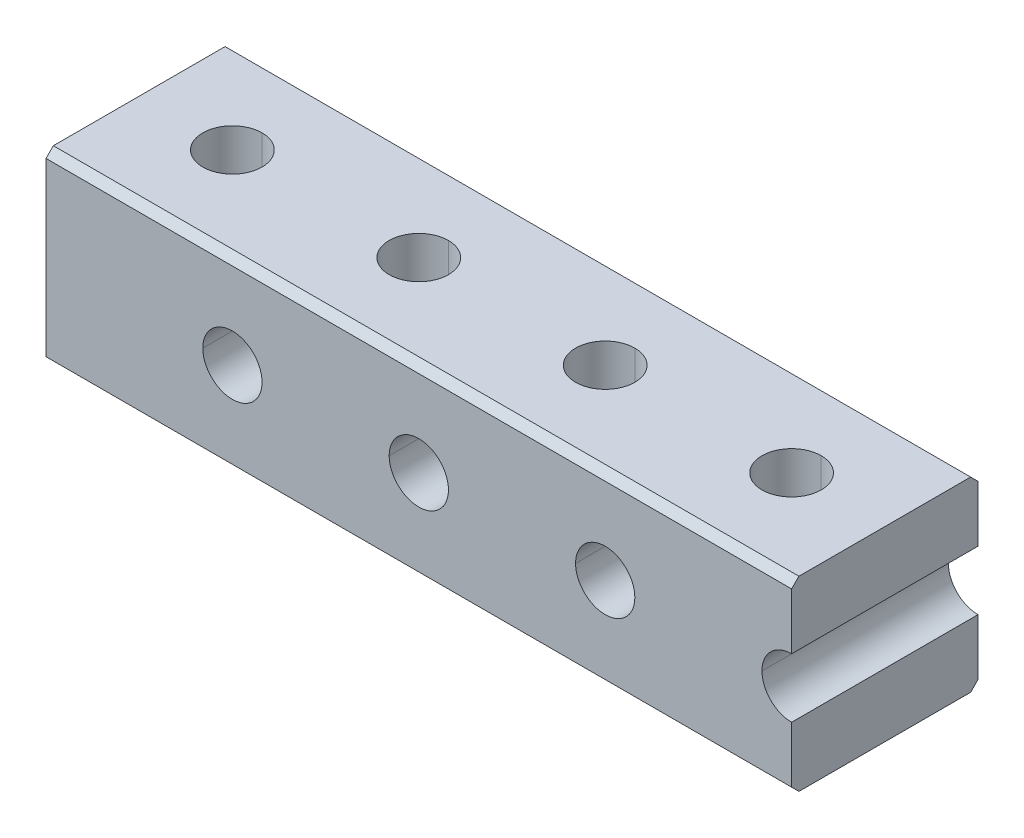
ISO-10303-21;
HEADER;
FILE_DESCRIPTION(('STEP AP214'),'2;1');
FILE_NAME('part.step','',(''),(''),'','','');
FILE_SCHEMA(('AUTOMOTIVE_DESIGN { 1 0 10303 214 1 1 1 1 }'));
ENDSEC;
DATA;
#1=APPLICATION_CONTEXT('core data for automotive mechanical design processes');
#2=APPLICATION_PROTOCOL_DEFINITION('international standard','automotive_design',2000,#1);
#3=PRODUCT_CONTEXT('',#1,'mechanical');
#4=PRODUCT('Part','Part','',(#3));
#5=PRODUCT_RELATED_PRODUCT_CATEGORY('part','',(#4));
#6=PRODUCT_DEFINITION_FORMATION('','',#4);
#7=PRODUCT_DEFINITION_CONTEXT('part definition',#1,'design');
#8=PRODUCT_DEFINITION('design','',#6,#7);
#9=PRODUCT_DEFINITION_SHAPE('','',#8);
#10=(LENGTH_UNIT() NAMED_UNIT(*) SI_UNIT(.MILLI.,.METRE.));
#11=(NAMED_UNIT(*) PLANE_ANGLE_UNIT() SI_UNIT($,.RADIAN.));
#12=(NAMED_UNIT(*) SI_UNIT($,.STERADIAN.) SOLID_ANGLE_UNIT());
#13=UNCERTAINTY_MEASURE_WITH_UNIT(LENGTH_MEASURE(1.E-05),#10,'distance_accuracy_value','');
#14=(GEOMETRIC_REPRESENTATION_CONTEXT(3) GLOBAL_UNCERTAINTY_ASSIGNED_CONTEXT((#13)) GLOBAL_UNIT_ASSIGNED_CONTEXT((#10,
#11,#12)) REPRESENTATION_CONTEXT('',''));
#15=CARTESIAN_POINT('',(0.,0.,0.));
#16=DIRECTION('',(0.,0.,1.));
#17=DIRECTION('',(1.,0.,0.));
#18=AXIS2_PLACEMENT_3D('',#15,#16,#17);
#19=CARTESIAN_POINT('',(76.2,5.85,6.35));
#20=DIRECTION('',(0.,-0.707106781186548,-0.707106781186548));
#21=DIRECTION('',(0.,-0.707106781186548,0.707106781186548));
#22=AXIS2_PLACEMENT_3D('',#19,#20,#21);
#23=PLANE('',#22);
#24=DIRECTION('',(-1.,0.,0.));
#25=VECTOR('',#24,1.);
#26=CARTESIAN_POINT('',(76.2,5.85,6.35));
#27=LINE('',#26,#25);
#28=CARTESIAN_POINT('',(-25.4,5.85,6.35));
#29=VERTEX_POINT('',#28);
#30=CARTESIAN_POINT('',(-76.2,5.85,6.35));
#31=VERTEX_POINT('',#30);
#32=EDGE_CURVE('E340',#29,#31,#27,.T.);
#33=ORIENTED_EDGE('',*,*,#32,.F.);
#34=DIRECTION('',(0.,0.707106781186548,-0.707106781186548));
#35=VECTOR('',#34,1.);
#36=CARTESIAN_POINT('',(-25.4,5.85,6.35));
#37=LINE('',#36,#35);
#38=CARTESIAN_POINT('',(-25.4,6.35,5.85));
#39=VERTEX_POINT('',#38);
#40=EDGE_CURVE('E265',#29,#39,#37,.T.);
#41=ORIENTED_EDGE('',*,*,#40,.T.);
#42=DIRECTION('',(1.,0.,0.));
#43=VECTOR('',#42,1.);
#44=CARTESIAN_POINT('',(76.2,6.35,5.85));
#45=LINE('',#44,#43);
#46=CARTESIAN_POINT('',(-76.2,6.35,5.85));
#47=VERTEX_POINT('',#46);
#48=EDGE_CURVE('E275',#47,#39,#45,.T.);
#49=ORIENTED_EDGE('',*,*,#48,.F.);
#50=DIRECTION('',(0.,0.707106781186548,-0.707106781186548));
#51=VECTOR('',#50,1.);
#52=CARTESIAN_POINT('',(-76.2,5.85,6.35));
#53=LINE('',#52,#51);
#54=EDGE_CURVE('E450',#31,#47,#53,.T.);
#55=ORIENTED_EDGE('',*,*,#54,.F.);
#56=EDGE_LOOP('',(#33,#41,#49,#55));
#57=FACE_BOUND('',#56,.T.);
#58=ADVANCED_FACE('F53',(#57),#23,.F.);
#59=CARTESIAN_POINT('',(76.2,6.35,-5.85));
#60=DIRECTION('',(0.,-0.707106781186548,0.707106781186548));
#61=DIRECTION('',(-1.,0.,0.));
#62=AXIS2_PLACEMENT_3D('',#59,#60,#61);
#63=PLANE('',#62);
#64=DIRECTION('',(-1.,0.,0.));
#65=VECTOR('',#64,1.);
#66=CARTESIAN_POINT('',(76.2,6.35,-5.85));
#67=LINE('',#66,#65);
#68=CARTESIAN_POINT('',(-25.4,6.35,-5.85));
#69=VERTEX_POINT('',#68);
#70=CARTESIAN_POINT('',(-76.2,6.35,-5.85));
#71=VERTEX_POINT('',#70);
#72=EDGE_CURVE('E272',#69,#71,#67,.T.);
#73=ORIENTED_EDGE('',*,*,#72,.F.);
#74=DIRECTION('',(0.,-0.707106781186548,-0.707106781186548));
#75=VECTOR('',#74,1.);
#76=CARTESIAN_POINT('',(-25.4,6.35,-5.85));
#77=LINE('',#76,#75);
#78=CARTESIAN_POINT('',(-25.4,5.85,-6.35));
#79=VERTEX_POINT('',#78);
#80=EDGE_CURVE('E255',#69,#79,#77,.T.);
#81=ORIENTED_EDGE('',*,*,#80,.T.);
#82=DIRECTION('',(1.,0.,0.));
#83=VECTOR('',#82,1.);
#84=CARTESIAN_POINT('',(76.2,5.85,-6.35));
#85=LINE('',#84,#83);
#86=CARTESIAN_POINT('',(-76.2,5.85,-6.35));
#87=VERTEX_POINT('',#86);
#88=EDGE_CURVE('E379',#87,#79,#85,.T.);
#89=ORIENTED_EDGE('',*,*,#88,.F.);
#90=DIRECTION('',(0.,-0.707106781186548,-0.707106781186548));
#91=VECTOR('',#90,1.);
#92=CARTESIAN_POINT('',(-76.2,6.35,-5.85));
#93=LINE('',#92,#91);
#94=EDGE_CURVE('E61',#71,#87,#93,.T.);
#95=ORIENTED_EDGE('',*,*,#94,.F.);
#96=EDGE_LOOP('',(#73,#81,#89,#95));
#97=FACE_BOUND('',#96,.T.);
#98=ADVANCED_FACE('F278',(#97),#63,.F.);
#99=CARTESIAN_POINT('',(76.2,-6.35,5.85));
#100=DIRECTION('',(0.,0.707106781186548,-0.707106781186548));
#101=DIRECTION('',(-1.,0.,0.));
#102=AXIS2_PLACEMENT_3D('',#99,#100,#101);
#103=PLANE('',#102);
#104=DIRECTION('',(-1.,0.,0.));
#105=VECTOR('',#104,1.);
#106=CARTESIAN_POINT('',(76.2,-6.35,5.85));
#107=LINE('',#106,#105);
#108=CARTESIAN_POINT('',(-25.4,-6.35,5.85));
#109=VERTEX_POINT('',#108);
#110=CARTESIAN_POINT('',(-76.2,-6.35,5.85));
#111=VERTEX_POINT('',#110);
#112=EDGE_CURVE('E434',#109,#111,#107,.T.);
#113=ORIENTED_EDGE('',*,*,#112,.F.);
#114=DIRECTION('',(0.,0.707106781186548,0.707106781186548));
#115=VECTOR('',#114,1.);
#116=CARTESIAN_POINT('',(-25.4,-6.35,5.85));
#117=LINE('',#116,#115);
#118=CARTESIAN_POINT('',(-25.4,-5.85,6.35));
#119=VERTEX_POINT('',#118);
#120=EDGE_CURVE('E266',#109,#119,#117,.T.);
#121=ORIENTED_EDGE('',*,*,#120,.T.);
#122=DIRECTION('',(1.,0.,0.));
#123=VECTOR('',#122,1.);
#124=CARTESIAN_POINT('',(76.2,-5.85,6.35));
#125=LINE('',#124,#123);
#126=CARTESIAN_POINT('',(-76.2,-5.85,6.35));
#127=VERTEX_POINT('',#126);
#128=EDGE_CURVE('E344',#127,#119,#125,.T.);
#129=ORIENTED_EDGE('',*,*,#128,.F.);
#130=DIRECTION('',(0.,0.707106781186548,0.707106781186548));
#131=VECTOR('',#130,1.);
#132=CARTESIAN_POINT('',(-76.2,-6.35,5.85));
#133=LINE('',#132,#131);
#134=EDGE_CURVE('E300',#111,#127,#133,.T.);
#135=ORIENTED_EDGE('',*,*,#134,.F.);
#136=EDGE_LOOP('',(#113,#121,#129,#135));
#137=FACE_BOUND('',#136,.T.);
#138=ADVANCED_FACE('F55',(#137),#103,.F.);
#139=CARTESIAN_POINT('',(76.2,-5.85,-6.35));
#140=DIRECTION('',(0.,0.707106781186548,0.707106781186548));
#141=DIRECTION('',(1.,0.,0.));
#142=AXIS2_PLACEMENT_3D('',#139,#140,#141);
#143=PLANE('',#142);
#144=DIRECTION('',(-1.,0.,0.));
#145=VECTOR('',#144,1.);
#146=CARTESIAN_POINT('',(76.2,-5.85,-6.35));
#147=LINE('',#146,#145);
#148=CARTESIAN_POINT('',(-25.4,-5.85,-6.35));
#149=VERTEX_POINT('',#148);
#150=CARTESIAN_POINT('',(-76.2,-5.85,-6.35));
#151=VERTEX_POINT('',#150);
#152=EDGE_CURVE('E398',#149,#151,#147,.T.);
#153=ORIENTED_EDGE('',*,*,#152,.F.);
#154=DIRECTION('',(0.,-0.707106781186548,0.707106781186548));
#155=VECTOR('',#154,1.);
#156=CARTESIAN_POINT('',(-25.4,-5.85,-6.35));
#157=LINE('',#156,#155);
#158=CARTESIAN_POINT('',(-25.4,-6.35,-5.85));
#159=VERTEX_POINT('',#158);
#160=EDGE_CURVE('E1385',#149,#159,#157,.T.);
#161=ORIENTED_EDGE('',*,*,#160,.T.);
#162=DIRECTION('',(1.,0.,0.));
#163=VECTOR('',#162,1.);
#164=CARTESIAN_POINT('',(76.2,-6.35,-5.85));
#165=LINE('',#164,#163);
#166=CARTESIAN_POINT('',(-76.2,-6.35,-5.85));
#167=VERTEX_POINT('',#166);
#168=EDGE_CURVE('E430',#167,#159,#165,.T.);
#169=ORIENTED_EDGE('',*,*,#168,.F.);
#170=DIRECTION('',(0.,-0.707106781186548,0.707106781186548));
#171=VECTOR('',#170,1.);
#172=CARTESIAN_POINT('',(-76.2,-5.85,-6.35));
#173=LINE('',#172,#171);
#174=EDGE_CURVE('E297',#151,#167,#173,.T.);
#175=ORIENTED_EDGE('',*,*,#174,.F.);
#176=EDGE_LOOP('',(#153,#161,#169,#175));
#177=FACE_BOUND('',#176,.T.);
#178=ADVANCED_FACE('F467',(#177),#143,.F.);
#179=CARTESIAN_POINT('',(-69.85,6.35,0.));
#180=DIRECTION('',(0.,1.,0.));
#181=DIRECTION('',(0.,0.,1.));
#182=AXIS2_PLACEMENT_3D('',#179,#180,#181);
#183=CYLINDRICAL_SURFACE('',#182,2.0193);
#184=DIRECTION('',(0.,1.,0.));
#185=VECTOR('',#184,1.);
#186=CARTESIAN_POINT('',(-69.85,6.35,-2.0193));
#187=LINE('',#186,#185);
#188=CARTESIAN_POINT('',(-69.85,-6.35,-2.0193));
#189=VERTEX_POINT('',#188);
#190=CARTESIAN_POINT('',(-69.85,6.35,-2.0193));
#191=VERTEX_POINT('',#190);
#192=EDGE_CURVE('E491',#189,#191,#187,.T.);
#193=ORIENTED_EDGE('',*,*,#192,.F.);
#194=CARTESIAN_POINT('',(-69.85,-6.35,0.));
#195=DIRECTION('',(0.,1.,0.));
#196=DIRECTION('',(0.,0.,1.));
#197=AXIS2_PLACEMENT_3D('',#194,#195,#196);
#198=CIRCLE('',#197,2.0193);
#199=CARTESIAN_POINT('',(-69.85,-6.35,2.0193));
#200=VERTEX_POINT('',#199);
#201=EDGE_CURVE('E437',#200,#189,#198,.T.);
#202=ORIENTED_EDGE('',*,*,#201,.F.);
#203=DIRECTION('',(0.,1.,0.));
#204=VECTOR('',#203,1.);
#205=CARTESIAN_POINT('',(-69.85,6.35,2.0193));
#206=LINE('',#205,#204);
#207=CARTESIAN_POINT('',(-69.85,6.35,2.0193));
#208=VERTEX_POINT('',#207);
#209=EDGE_CURVE('E519',#200,#208,#206,.T.);
#210=ORIENTED_EDGE('',*,*,#209,.T.);
#211=CARTESIAN_POINT('',(-69.85,6.35,0.));
#212=DIRECTION('',(0.,1.,0.));
#213=DIRECTION('',(0.,0.,1.));
#214=AXIS2_PLACEMENT_3D('',#211,#212,#213);
#215=CIRCLE('',#214,2.0193);
#216=EDGE_CURVE('E401',#208,#191,#215,.T.);
#217=ORIENTED_EDGE('',*,*,#216,.T.);
#218=EDGE_LOOP('',(#193,#202,#210,#217));
#219=FACE_BOUND('',#218,.T.);
#220=ADVANCED_FACE('F558',(#219),#183,.F.);
#221=CARTESIAN_POINT('',(-57.15,6.35,0.));
#222=DIRECTION('',(0.,1.,0.));
#223=DIRECTION('',(0.,0.,1.));
#224=AXIS2_PLACEMENT_3D('',#221,#222,#223);
#225=CYLINDRICAL_SURFACE('',#224,2.0193);
#226=DIRECTION('',(0.,1.,0.));
#227=VECTOR('',#226,1.);
#228=CARTESIAN_POINT('',(-57.15,6.35,-2.0193));
#229=LINE('',#228,#227);
#230=CARTESIAN_POINT('',(-57.15,-6.35,-2.0193));
#231=VERTEX_POINT('',#230);
#232=CARTESIAN_POINT('',(-57.15,6.35,-2.0193));
#233=VERTEX_POINT('',#232);
#234=EDGE_CURVE('E502',#231,#233,#229,.T.);
#235=ORIENTED_EDGE('',*,*,#234,.F.);
#236=CARTESIAN_POINT('',(-57.15,-6.35,0.));
#237=DIRECTION('',(0.,1.,0.));
#238=DIRECTION('',(0.,0.,1.));
#239=AXIS2_PLACEMENT_3D('',#236,#237,#238);
#240=CIRCLE('',#239,2.0193);
#241=CARTESIAN_POINT('',(-57.15,-6.35,2.0193));
#242=VERTEX_POINT('',#241);
#243=EDGE_CURVE('E440',#242,#231,#240,.T.);
#244=ORIENTED_EDGE('',*,*,#243,.F.);
#245=DIRECTION('',(0.,1.,0.));
#246=VECTOR('',#245,1.);
#247=CARTESIAN_POINT('',(-57.15,6.35,2.0193));
#248=LINE('',#247,#246);
#249=CARTESIAN_POINT('',(-57.15,6.35,2.0193));
#250=VERTEX_POINT('',#249);
#251=EDGE_CURVE('E307',#242,#250,#248,.T.);
#252=ORIENTED_EDGE('',*,*,#251,.T.);
#253=CARTESIAN_POINT('',(-57.15,6.35,0.));
#254=DIRECTION('',(0.,1.,0.));
#255=DIRECTION('',(0.,0.,1.));
#256=AXIS2_PLACEMENT_3D('',#253,#254,#255);
#257=CIRCLE('',#256,2.0193);
#258=EDGE_CURVE('E406',#250,#233,#257,.T.);
#259=ORIENTED_EDGE('',*,*,#258,.T.);
#260=EDGE_LOOP('',(#235,#244,#252,#259));
#261=FACE_BOUND('',#260,.T.);
#262=ADVANCED_FACE('F599',(#261),#225,.F.);
#263=CARTESIAN_POINT('',(-44.45,6.35,0.));
#264=DIRECTION('',(0.,1.,0.));
#265=DIRECTION('',(0.,0.,1.));
#266=AXIS2_PLACEMENT_3D('',#263,#264,#265);
#267=CYLINDRICAL_SURFACE('',#266,2.0193);
#268=DIRECTION('',(0.,1.,0.));
#269=VECTOR('',#268,1.);
#270=CARTESIAN_POINT('',(-44.45,6.35,-2.0193));
#271=LINE('',#270,#269);
#272=CARTESIAN_POINT('',(-44.45,-6.35,-2.0193));
#273=VERTEX_POINT('',#272);
#274=CARTESIAN_POINT('',(-44.45,6.35,-2.0193));
#275=VERTEX_POINT('',#274);
#276=EDGE_CURVE('E306',#273,#275,#271,.T.);
#277=ORIENTED_EDGE('',*,*,#276,.F.);
#278=CARTESIAN_POINT('',(-44.45,-6.35,0.));
#279=DIRECTION('',(0.,1.,0.));
#280=DIRECTION('',(0.,0.,1.));
#281=AXIS2_PLACEMENT_3D('',#278,#279,#280);
#282=CIRCLE('',#281,2.0193);
#283=CARTESIAN_POINT('',(-44.45,-6.35,2.0193));
#284=VERTEX_POINT('',#283);
#285=EDGE_CURVE('E443',#284,#273,#282,.T.);
#286=ORIENTED_EDGE('',*,*,#285,.F.);
#287=DIRECTION('',(0.,1.,0.));
#288=VECTOR('',#287,1.);
#289=CARTESIAN_POINT('',(-44.45,6.35,2.0193));
#290=LINE('',#289,#288);
#291=CARTESIAN_POINT('',(-44.45,6.35,2.0193));
#292=VERTEX_POINT('',#291);
#293=EDGE_CURVE('E308',#284,#292,#290,.T.);
#294=ORIENTED_EDGE('',*,*,#293,.T.);
#295=CARTESIAN_POINT('',(-44.45,6.35,0.));
#296=DIRECTION('',(0.,1.,0.));
#297=DIRECTION('',(0.,0.,1.));
#298=AXIS2_PLACEMENT_3D('',#295,#296,#297);
#299=CIRCLE('',#298,2.0193);
#300=EDGE_CURVE('E339',#292,#275,#299,.T.);
#301=ORIENTED_EDGE('',*,*,#300,.T.);
#302=EDGE_LOOP('',(#277,#286,#294,#301));
#303=FACE_BOUND('',#302,.T.);
#304=ADVANCED_FACE('F546',(#303),#267,.F.);
#305=CARTESIAN_POINT('',(-31.75,6.35,0.));
#306=DIRECTION('',(0.,1.,0.));
#307=DIRECTION('',(0.,0.,1.));
#308=AXIS2_PLACEMENT_3D('',#305,#306,#307);
#309=CYLINDRICAL_SURFACE('',#308,2.0193);
#310=DIRECTION('',(0.,1.,0.));
#311=VECTOR('',#310,1.);
#312=CARTESIAN_POINT('',(-31.75,6.35,-2.0193));
#313=LINE('',#312,#311);
#314=CARTESIAN_POINT('',(-31.75,-6.35,-2.0193));
#315=VERTEX_POINT('',#314);
#316=CARTESIAN_POINT('',(-31.75,6.35,-2.0193));
#317=VERTEX_POINT('',#316);
#318=EDGE_CURVE('E317',#315,#317,#313,.T.);
#319=ORIENTED_EDGE('',*,*,#318,.F.);
#320=CARTESIAN_POINT('',(-31.75,-6.35,0.));
#321=DIRECTION('',(0.,1.,0.));
#322=DIRECTION('',(0.,0.,1.));
#323=AXIS2_PLACEMENT_3D('',#320,#321,#322);
#324=CIRCLE('',#323,2.0193);
#325=CARTESIAN_POINT('',(-31.75,-6.35,2.0193));
#326=VERTEX_POINT('',#325);
#327=EDGE_CURVE('E301',#326,#315,#324,.T.);
#328=ORIENTED_EDGE('',*,*,#327,.F.);
#329=DIRECTION('',(0.,1.,0.));
#330=VECTOR('',#329,1.);
#331=CARTESIAN_POINT('',(-31.75,6.35,2.0193));
#332=LINE('',#331,#330);
#333=CARTESIAN_POINT('',(-31.75,6.35,2.0193));
#334=VERTEX_POINT('',#333);
#335=EDGE_CURVE('E295',#326,#334,#332,.T.);
#336=ORIENTED_EDGE('',*,*,#335,.T.);
#337=CARTESIAN_POINT('',(-31.75,6.35,0.));
#338=DIRECTION('',(0.,1.,0.));
#339=DIRECTION('',(0.,0.,1.));
#340=AXIS2_PLACEMENT_3D('',#337,#338,#339);
#341=CIRCLE('',#340,2.0193);
#342=EDGE_CURVE('E335',#334,#317,#341,.T.);
#343=ORIENTED_EDGE('',*,*,#342,.T.);
#344=EDGE_LOOP('',(#319,#328,#336,#343));
#345=FACE_BOUND('',#344,.T.);
#346=ADVANCED_FACE('F593',(#345),#309,.F.);
#347=CARTESIAN_POINT('',(-63.5,0.,6.35));
#348=DIRECTION('',(0.,0.,1.));
#349=DIRECTION('',(1.,0.,0.));
#350=AXIS2_PLACEMENT_3D('',#347,#348,#349);
#351=CYLINDRICAL_SURFACE('',#350,2.0193);
#352=DIRECTION('',(0.,0.,1.));
#353=VECTOR('',#352,1.);
#354=CARTESIAN_POINT('',(-65.5193,0.,6.35));
#355=LINE('',#354,#353);
#356=CARTESIAN_POINT('',(-65.5193,0.,-6.35));
#357=VERTEX_POINT('',#356);
#358=CARTESIAN_POINT('',(-65.5193,0.,6.35));
#359=VERTEX_POINT('',#358);
#360=EDGE_CURVE('E330',#357,#359,#355,.T.);
#361=ORIENTED_EDGE('',*,*,#360,.F.);
#362=CARTESIAN_POINT('',(-63.5,0.,-6.35));
#363=DIRECTION('',(0.,0.,1.));
#364=DIRECTION('',(1.,0.,0.));
#365=AXIS2_PLACEMENT_3D('',#362,#363,#364);
#366=CIRCLE('',#365,2.0193);
#367=CARTESIAN_POINT('',(-61.4807,0.,-6.35));
#368=VERTEX_POINT('',#367);
#369=EDGE_CURVE('E334',#368,#357,#366,.T.);
#370=ORIENTED_EDGE('',*,*,#369,.F.);
#371=DIRECTION('',(0.,0.,1.));
#372=VECTOR('',#371,1.);
#373=CARTESIAN_POINT('',(-61.4807,0.,6.35));
#374=LINE('',#373,#372);
#375=CARTESIAN_POINT('',(-61.4807,0.,6.35));
#376=VERTEX_POINT('',#375);
#377=EDGE_CURVE('E361',#368,#376,#374,.T.);
#378=ORIENTED_EDGE('',*,*,#377,.T.);
#379=CARTESIAN_POINT('',(-63.5,0.,6.35));
#380=DIRECTION('',(0.,0.,1.));
#381=DIRECTION('',(1.,0.,0.));
#382=AXIS2_PLACEMENT_3D('',#379,#380,#381);
#383=CIRCLE('',#382,2.0193);
#384=EDGE_CURVE('E343',#376,#359,#383,.T.);
#385=ORIENTED_EDGE('',*,*,#384,.T.);
#386=EDGE_LOOP('',(#361,#370,#378,#385));
#387=FACE_BOUND('',#386,.T.);
#388=ADVANCED_FACE('F590',(#387),#351,.F.);
#389=CARTESIAN_POINT('',(-50.8,0.,6.35));
#390=DIRECTION('',(0.,0.,1.));
#391=DIRECTION('',(1.,0.,0.));
#392=AXIS2_PLACEMENT_3D('',#389,#390,#391);
#393=CYLINDRICAL_SURFACE('',#392,2.0193);
#394=DIRECTION('',(0.,0.,1.));
#395=VECTOR('',#394,1.);
#396=CARTESIAN_POINT('',(-52.8193,0.,6.35));
#397=LINE('',#396,#395);
#398=CARTESIAN_POINT('',(-52.8193,0.,-6.35));
#399=VERTEX_POINT('',#398);
#400=CARTESIAN_POINT('',(-52.8193,0.,6.35));
#401=VERTEX_POINT('',#400);
#402=EDGE_CURVE('E369',#399,#401,#397,.T.);
#403=ORIENTED_EDGE('',*,*,#402,.F.);
#404=CARTESIAN_POINT('',(-50.8,0.,-6.35));
#405=DIRECTION('',(0.,0.,1.));
#406=DIRECTION('',(1.,0.,0.));
#407=AXIS2_PLACEMENT_3D('',#404,#405,#406);
#408=CIRCLE('',#407,2.0193);
#409=CARTESIAN_POINT('',(-48.7807,0.,-6.35));
#410=VERTEX_POINT('',#409);
#411=EDGE_CURVE('E331',#410,#399,#408,.T.);
#412=ORIENTED_EDGE('',*,*,#411,.F.);
#413=DIRECTION('',(0.,0.,1.));
#414=VECTOR('',#413,1.);
#415=CARTESIAN_POINT('',(-48.7807,0.,6.35));
#416=LINE('',#415,#414);
#417=CARTESIAN_POINT('',(-48.7807,0.,6.35));
#418=VERTEX_POINT('',#417);
#419=EDGE_CURVE('E374',#410,#418,#416,.T.);
#420=ORIENTED_EDGE('',*,*,#419,.T.);
#421=CARTESIAN_POINT('',(-50.8,0.,6.35));
#422=DIRECTION('',(0.,0.,1.));
#423=DIRECTION('',(1.,0.,0.));
#424=AXIS2_PLACEMENT_3D('',#421,#422,#423);
#425=CIRCLE('',#424,2.0193);
#426=EDGE_CURVE('E422',#418,#401,#425,.T.);
#427=ORIENTED_EDGE('',*,*,#426,.T.);
#428=EDGE_LOOP('',(#403,#412,#420,#427));
#429=FACE_BOUND('',#428,.T.);
#430=ADVANCED_FACE('F588',(#429),#393,.F.);
#431=CARTESIAN_POINT('',(-38.1,0.,6.35));
#432=DIRECTION('',(0.,0.,1.));
#433=DIRECTION('',(1.,0.,0.));
#434=AXIS2_PLACEMENT_3D('',#431,#432,#433);
#435=CYLINDRICAL_SURFACE('',#434,2.0193);
#436=DIRECTION('',(0.,0.,1.));
#437=VECTOR('',#436,1.);
#438=CARTESIAN_POINT('',(-40.1193,0.,6.35));
#439=LINE('',#438,#437);
#440=CARTESIAN_POINT('',(-40.1193,0.,-6.35));
#441=VERTEX_POINT('',#440);
#442=CARTESIAN_POINT('',(-40.1193,0.,6.35));
#443=VERTEX_POINT('',#442);
#444=EDGE_CURVE('E350',#441,#443,#439,.T.);
#445=ORIENTED_EDGE('',*,*,#444,.F.);
#446=CARTESIAN_POINT('',(-38.1,0.,-6.35));
#447=DIRECTION('',(0.,0.,1.));
#448=DIRECTION('',(1.,0.,0.));
#449=AXIS2_PLACEMENT_3D('',#446,#447,#448);
#450=CIRCLE('',#449,2.0193);
#451=CARTESIAN_POINT('',(-36.0807,0.,-6.35));
#452=VERTEX_POINT('',#451);
#453=EDGE_CURVE('E291',#452,#441,#450,.T.);
#454=ORIENTED_EDGE('',*,*,#453,.F.);
#455=DIRECTION('',(0.,0.,1.));
#456=VECTOR('',#455,1.);
#457=CARTESIAN_POINT('',(-36.0807,0.,6.35));
#458=LINE('',#457,#456);
#459=CARTESIAN_POINT('',(-36.0807,0.,6.35));
#460=VERTEX_POINT('',#459);
#461=EDGE_CURVE('E349',#452,#460,#458,.T.);
#462=ORIENTED_EDGE('',*,*,#461,.T.);
#463=CARTESIAN_POINT('',(-38.1,0.,6.35));
#464=DIRECTION('',(0.,0.,1.));
#465=DIRECTION('',(1.,0.,0.));
#466=AXIS2_PLACEMENT_3D('',#463,#464,#465);
#467=CIRCLE('',#466,2.0193);
#468=EDGE_CURVE('E325',#460,#443,#467,.T.);
#469=ORIENTED_EDGE('',*,*,#468,.T.);
#470=EDGE_LOOP('',(#445,#454,#462,#469));
#471=FACE_BOUND('',#470,.T.);
#472=ADVANCED_FACE('F585',(#471),#435,.F.);
#473=CARTESIAN_POINT('',(-25.4,0.,6.35));
#474=DIRECTION('',(0.,0.,1.));
#475=DIRECTION('',(1.,0.,0.));
#476=AXIS2_PLACEMENT_3D('',#473,#474,#475);
#477=CYLINDRICAL_SURFACE('',#476,2.0193);
#478=CARTESIAN_POINT('',(-25.4,0.,-6.35));
#479=DIRECTION('',(0.,0.,1.));
#480=DIRECTION('',(1.,0.,0.));
#481=AXIS2_PLACEMENT_3D('',#478,#479,#480);
#482=CIRCLE('',#481,2.0193);
#483=CARTESIAN_POINT('',(-25.4,2.0193,-6.35));
#484=VERTEX_POINT('',#483);
#485=CARTESIAN_POINT('',(-27.4193,0.,-6.35));
#486=VERTEX_POINT('',#485);
#487=EDGE_CURVE('E282',#484,#486,#482,.T.);
#488=ORIENTED_EDGE('',*,*,#487,.F.);
#489=DIRECTION('',(0.,0.,1.));
#490=VECTOR('',#489,1.);
#491=CARTESIAN_POINT('',(-25.4,2.0193,6.35));
#492=LINE('',#491,#490);
#493=CARTESIAN_POINT('',(-25.4,2.0193,6.35));
#494=VERTEX_POINT('',#493);
#495=EDGE_CURVE('E68',#484,#494,#492,.T.);
#496=ORIENTED_EDGE('',*,*,#495,.T.);
#497=CARTESIAN_POINT('',(-25.4,0.,6.35));
#498=DIRECTION('',(0.,0.,1.));
#499=DIRECTION('',(1.,0.,0.));
#500=AXIS2_PLACEMENT_3D('',#497,#498,#499);
#501=CIRCLE('',#500,2.0193);
#502=CARTESIAN_POINT('',(-27.4193,0.,6.35));
#503=VERTEX_POINT('',#502);
#504=EDGE_CURVE('E322',#494,#503,#501,.T.);
#505=ORIENTED_EDGE('',*,*,#504,.T.);
#506=DIRECTION('',(0.,0.,1.));
#507=VECTOR('',#506,1.);
#508=CARTESIAN_POINT('',(-27.4193,0.,6.35));
#509=LINE('',#508,#507);
#510=EDGE_CURVE('E390',#486,#503,#509,.T.);
#511=ORIENTED_EDGE('',*,*,#510,.F.);
#512=EDGE_LOOP('',(#488,#496,#505,#511));
#513=FACE_BOUND('',#512,.T.);
#514=ADVANCED_FACE('F572',(#513),#477,.F.);
#515=CARTESIAN_POINT('',(-76.2,0.,0.));
#516=DIRECTION('',(1.,0.,0.));
#517=DIRECTION('',(0.,1.,0.));
#518=AXIS2_PLACEMENT_3D('',#515,#516,#517);
#519=PLANE('',#518);
#520=DIRECTION('',(0.,1.,0.));
#521=VECTOR('',#520,1.);
#522=CARTESIAN_POINT('',(-76.2,6.35,-6.35));
#523=LINE('',#522,#521);
#524=EDGE_CURVE('E382',#151,#87,#523,.T.);
#525=ORIENTED_EDGE('',*,*,#524,.F.);
#526=ORIENTED_EDGE('',*,*,#174,.T.);
#527=DIRECTION('',(0.,0.,-1.));
#528=VECTOR('',#527,1.);
#529=CARTESIAN_POINT('',(-76.2,-6.35,6.35));
#530=LINE('',#529,#528);
#531=EDGE_CURVE('E324',#111,#167,#530,.T.);
#532=ORIENTED_EDGE('',*,*,#531,.F.);
#533=ORIENTED_EDGE('',*,*,#134,.T.);
#534=DIRECTION('',(0.,-1.,0.));
#535=VECTOR('',#534,1.);
#536=CARTESIAN_POINT('',(-76.2,6.35,6.35));
#537=LINE('',#536,#535);
#538=EDGE_CURVE('E338',#31,#127,#537,.T.);
#539=ORIENTED_EDGE('',*,*,#538,.F.);
#540=ORIENTED_EDGE('',*,*,#54,.T.);
#541=DIRECTION('',(0.,0.,1.));
#542=VECTOR('',#541,1.);
#543=CARTESIAN_POINT('',(-76.2,6.35,6.35));
#544=LINE('',#543,#542);
#545=EDGE_CURVE('E281',#71,#47,#544,.T.);
#546=ORIENTED_EDGE('',*,*,#545,.F.);
#547=ORIENTED_EDGE('',*,*,#94,.T.);
#548=EDGE_LOOP('',(#525,#526,#532,#533,#539,#540,#546,#547));
#549=FACE_BOUND('',#548,.T.);
#550=ADVANCED_FACE('F458',(#549),#519,.F.);
#551=CARTESIAN_POINT('',(76.2,-6.35,6.35));
#552=DIRECTION('',(0.,1.,0.));
#553=DIRECTION('',(1.,0.,0.));
#554=AXIS2_PLACEMENT_3D('',#551,#552,#553);
#555=PLANE('',#554);
#556=ORIENTED_EDGE('',*,*,#327,.T.);
#557=CARTESIAN_POINT('',(-31.75,-6.35,0.));
#558=DIRECTION('',(0.,1.,0.));
#559=DIRECTION('',(0.,0.,1.));
#560=AXIS2_PLACEMENT_3D('',#557,#558,#559);
#561=CIRCLE('',#560,2.0193);
#562=EDGE_CURVE('E312',#315,#326,#561,.T.);
#563=ORIENTED_EDGE('',*,*,#562,.T.);
#564=EDGE_LOOP('',(#556,#563));
#565=FACE_BOUND('',#564,.T.);
#566=ORIENTED_EDGE('',*,*,#285,.T.);
#567=CARTESIAN_POINT('',(-44.45,-6.35,0.));
#568=DIRECTION('',(0.,1.,0.));
#569=DIRECTION('',(0.,0.,1.));
#570=AXIS2_PLACEMENT_3D('',#567,#568,#569);
#571=CIRCLE('',#570,2.0193);
#572=EDGE_CURVE('E302',#273,#284,#571,.T.);
#573=ORIENTED_EDGE('',*,*,#572,.T.);
#574=EDGE_LOOP('',(#566,#573));
#575=FACE_BOUND('',#574,.T.);
#576=ORIENTED_EDGE('',*,*,#243,.T.);
#577=CARTESIAN_POINT('',(-57.15,-6.35,0.));
#578=DIRECTION('',(0.,1.,0.));
#579=DIRECTION('',(0.,0.,1.));
#580=AXIS2_PLACEMENT_3D('',#577,#578,#579);
#581=CIRCLE('',#580,2.0193);
#582=EDGE_CURVE('E523',#231,#242,#581,.T.);
#583=ORIENTED_EDGE('',*,*,#582,.T.);
#584=EDGE_LOOP('',(#576,#583));
#585=FACE_BOUND('',#584,.T.);
#586=ORIENTED_EDGE('',*,*,#201,.T.);
#587=CARTESIAN_POINT('',(-69.85,-6.35,0.));
#588=DIRECTION('',(0.,1.,0.));
#589=DIRECTION('',(0.,0.,1.));
#590=AXIS2_PLACEMENT_3D('',#587,#588,#589);
#591=CIRCLE('',#590,2.0193);
#592=EDGE_CURVE('E487',#189,#200,#591,.T.);
#593=ORIENTED_EDGE('',*,*,#592,.T.);
#594=EDGE_LOOP('',(#586,#593));
#595=FACE_BOUND('',#594,.T.);
#596=ORIENTED_EDGE('',*,*,#168,.T.);
#597=DIRECTION('',(0.,0.,-1.));
#598=VECTOR('',#597,1.);
#599=CARTESIAN_POINT('',(-25.4,-6.35,6.35));
#600=LINE('',#599,#598);
#601=EDGE_CURVE('E476',#109,#159,#600,.T.);
#602=ORIENTED_EDGE('',*,*,#601,.F.);
#603=ORIENTED_EDGE('',*,*,#112,.T.);
#604=ORIENTED_EDGE('',*,*,#531,.T.);
#605=EDGE_LOOP('',(#596,#602,#603,#604));
#606=FACE_BOUND('',#605,.T.);
#607=ADVANCED_FACE('F473',(#565,#575,#585,#595,#606),#555,.F.);
#608=CARTESIAN_POINT('',(76.2,6.35,6.35));
#609=DIRECTION('',(0.,0.,-1.));
#610=DIRECTION('',(-1.,0.,0.));
#611=AXIS2_PLACEMENT_3D('',#608,#609,#610);
#612=PLANE('',#611);
#613=ORIENTED_EDGE('',*,*,#128,.T.);
#614=DIRECTION('',(0.,-1.,0.));
#615=VECTOR('',#614,1.);
#616=CARTESIAN_POINT('',(-25.4,-6.35,6.35));
#617=LINE('',#616,#615);
#618=CARTESIAN_POINT('',(-25.4,-2.0193,6.35));
#619=VERTEX_POINT('',#618);
#620=EDGE_CURVE('E276',#619,#119,#617,.T.);
#621=ORIENTED_EDGE('',*,*,#620,.F.);
#622=CARTESIAN_POINT('',(-25.4,0.,6.35));
#623=DIRECTION('',(0.,0.,1.));
#624=DIRECTION('',(1.,0.,0.));
#625=AXIS2_PLACEMENT_3D('',#622,#623,#624);
#626=CIRCLE('',#625,2.0193);
#627=EDGE_CURVE('E394',#503,#619,#626,.T.);
#628=ORIENTED_EDGE('',*,*,#627,.F.);
#629=ORIENTED_EDGE('',*,*,#504,.F.);
#630=EDGE_CURVE('E1382',#29,#494,#617,.T.);
#631=ORIENTED_EDGE('',*,*,#630,.F.);
#632=ORIENTED_EDGE('',*,*,#32,.T.);
#633=ORIENTED_EDGE('',*,*,#538,.T.);
#634=EDGE_LOOP('',(#613,#621,#628,#629,#631,#632,#633));
#635=FACE_BOUND('',#634,.T.);
#636=ORIENTED_EDGE('',*,*,#468,.F.);
#637=CARTESIAN_POINT('',(-38.1,0.,6.35));
#638=DIRECTION('',(0.,0.,1.));
#639=DIRECTION('',(1.,0.,0.));
#640=AXIS2_PLACEMENT_3D('',#637,#638,#639);
#641=CIRCLE('',#640,2.0193);
#642=EDGE_CURVE('E345',#443,#460,#641,.T.);
#643=ORIENTED_EDGE('',*,*,#642,.F.);
#644=EDGE_LOOP('',(#636,#643));
#645=FACE_BOUND('',#644,.T.);
#646=ORIENTED_EDGE('',*,*,#426,.F.);
#647=CARTESIAN_POINT('',(-50.8,0.,6.35));
#648=DIRECTION('',(0.,0.,1.));
#649=DIRECTION('',(1.,0.,0.));
#650=AXIS2_PLACEMENT_3D('',#647,#648,#649);
#651=CIRCLE('',#650,2.0193);
#652=EDGE_CURVE('E370',#401,#418,#651,.T.);
#653=ORIENTED_EDGE('',*,*,#652,.F.);
#654=EDGE_LOOP('',(#646,#653));
#655=FACE_BOUND('',#654,.T.);
#656=ORIENTED_EDGE('',*,*,#384,.F.);
#657=CARTESIAN_POINT('',(-63.5,0.,6.35));
#658=DIRECTION('',(0.,0.,1.));
#659=DIRECTION('',(1.,0.,0.));
#660=AXIS2_PLACEMENT_3D('',#657,#658,#659);
#661=CIRCLE('',#660,2.0193);
#662=EDGE_CURVE('E354',#359,#376,#661,.T.);
#663=ORIENTED_EDGE('',*,*,#662,.F.);
#664=EDGE_LOOP('',(#656,#663));
#665=FACE_BOUND('',#664,.T.);
#666=ADVANCED_FACE('F481',(#635,#645,#655,#665),#612,.F.);
#667=CARTESIAN_POINT('',(76.2,6.35,6.35));
#668=DIRECTION('',(0.,-1.,0.));
#669=DIRECTION('',(0.,0.,-1.));
#670=AXIS2_PLACEMENT_3D('',#667,#668,#669);
#671=PLANE('',#670);
#672=ORIENTED_EDGE('',*,*,#342,.F.);
#673=CARTESIAN_POINT('',(-31.75,6.35,0.));
#674=DIRECTION('',(0.,1.,0.));
#675=DIRECTION('',(0.,0.,1.));
#676=AXIS2_PLACEMENT_3D('',#673,#674,#675);
#677=CIRCLE('',#676,2.0193);
#678=EDGE_CURVE('E321',#317,#334,#677,.T.);
#679=ORIENTED_EDGE('',*,*,#678,.F.);
#680=EDGE_LOOP('',(#672,#679));
#681=FACE_BOUND('',#680,.T.);
#682=ORIENTED_EDGE('',*,*,#300,.F.);
#683=CARTESIAN_POINT('',(-44.45,6.35,0.));
#684=DIRECTION('',(0.,1.,0.));
#685=DIRECTION('',(0.,0.,1.));
#686=AXIS2_PLACEMENT_3D('',#683,#684,#685);
#687=CIRCLE('',#686,2.0193);
#688=EDGE_CURVE('E313',#275,#292,#687,.T.);
#689=ORIENTED_EDGE('',*,*,#688,.F.);
#690=EDGE_LOOP('',(#682,#689));
#691=FACE_BOUND('',#690,.T.);
#692=ORIENTED_EDGE('',*,*,#258,.F.);
#693=CARTESIAN_POINT('',(-57.15,6.35,0.));
#694=DIRECTION('',(0.,1.,0.));
#695=DIRECTION('',(0.,0.,1.));
#696=AXIS2_PLACEMENT_3D('',#693,#694,#695);
#697=CIRCLE('',#696,2.0193);
#698=EDGE_CURVE('E498',#233,#250,#697,.T.);
#699=ORIENTED_EDGE('',*,*,#698,.F.);
#700=EDGE_LOOP('',(#692,#699));
#701=FACE_BOUND('',#700,.T.);
#702=ORIENTED_EDGE('',*,*,#216,.F.);
#703=CARTESIAN_POINT('',(-69.85,6.35,0.));
#704=DIRECTION('',(0.,1.,0.));
#705=DIRECTION('',(0.,0.,1.));
#706=AXIS2_PLACEMENT_3D('',#703,#704,#705);
#707=CIRCLE('',#706,2.0193);
#708=EDGE_CURVE('E506',#191,#208,#707,.T.);
#709=ORIENTED_EDGE('',*,*,#708,.F.);
#710=EDGE_LOOP('',(#702,#709));
#711=FACE_BOUND('',#710,.T.);
#712=ORIENTED_EDGE('',*,*,#48,.T.);
#713=DIRECTION('',(0.,0.,1.));
#714=VECTOR('',#713,1.);
#715=CARTESIAN_POINT('',(-25.4,6.35,6.35));
#716=LINE('',#715,#714);
#717=EDGE_CURVE('E258',#69,#39,#716,.T.);
#718=ORIENTED_EDGE('',*,*,#717,.F.);
#719=ORIENTED_EDGE('',*,*,#72,.T.);
#720=ORIENTED_EDGE('',*,*,#545,.T.);
#721=EDGE_LOOP('',(#712,#718,#719,#720));
#722=FACE_BOUND('',#721,.T.);
#723=ADVANCED_FACE('F270',(#681,#691,#701,#711,#722),#671,.F.);
#724=CARTESIAN_POINT('',(76.2,6.35,-6.35));
#725=DIRECTION('',(0.,0.,1.));
#726=DIRECTION('',(0.,-1.,0.));
#727=AXIS2_PLACEMENT_3D('',#724,#725,#726);
#728=PLANE('',#727);
#729=ORIENTED_EDGE('',*,*,#88,.T.);
#730=DIRECTION('',(0.,1.,0.));
#731=VECTOR('',#730,1.);
#732=CARTESIAN_POINT('',(-25.4,-6.35,-6.35));
#733=LINE('',#732,#731);
#734=EDGE_CURVE('E260',#484,#79,#733,.T.);
#735=ORIENTED_EDGE('',*,*,#734,.F.);
#736=ORIENTED_EDGE('',*,*,#487,.T.);
#737=CARTESIAN_POINT('',(-25.4,0.,-6.35));
#738=DIRECTION('',(0.,0.,1.));
#739=DIRECTION('',(1.,0.,0.));
#740=AXIS2_PLACEMENT_3D('',#737,#738,#739);
#741=CIRCLE('',#740,2.0193);
#742=CARTESIAN_POINT('',(-25.4,-2.0193,-6.35));
#743=VERTEX_POINT('',#742);
#744=EDGE_CURVE('E386',#486,#743,#741,.T.);
#745=ORIENTED_EDGE('',*,*,#744,.T.);
#746=EDGE_CURVE('E76',#149,#743,#733,.T.);
#747=ORIENTED_EDGE('',*,*,#746,.F.);
#748=ORIENTED_EDGE('',*,*,#152,.T.);
#749=ORIENTED_EDGE('',*,*,#524,.T.);
#750=EDGE_LOOP('',(#729,#735,#736,#745,#747,#748,#749));
#751=FACE_BOUND('',#750,.T.);
#752=ORIENTED_EDGE('',*,*,#453,.T.);
#753=CARTESIAN_POINT('',(-38.1,0.,-6.35));
#754=DIRECTION('',(0.,0.,1.));
#755=DIRECTION('',(1.,0.,0.));
#756=AXIS2_PLACEMENT_3D('',#753,#754,#755);
#757=CIRCLE('',#756,2.0193);
#758=EDGE_CURVE('E378',#441,#452,#757,.T.);
#759=ORIENTED_EDGE('',*,*,#758,.T.);
#760=EDGE_LOOP('',(#752,#759));
#761=FACE_BOUND('',#760,.T.);
#762=ORIENTED_EDGE('',*,*,#411,.T.);
#763=CARTESIAN_POINT('',(-50.8,0.,-6.35));
#764=DIRECTION('',(0.,0.,1.));
#765=DIRECTION('',(1.,0.,0.));
#766=AXIS2_PLACEMENT_3D('',#763,#764,#765);
#767=CIRCLE('',#766,2.0193);
#768=EDGE_CURVE('E365',#399,#410,#767,.T.);
#769=ORIENTED_EDGE('',*,*,#768,.T.);
#770=EDGE_LOOP('',(#762,#769));
#771=FACE_BOUND('',#770,.T.);
#772=ORIENTED_EDGE('',*,*,#369,.T.);
#773=CARTESIAN_POINT('',(-63.5,0.,-6.35));
#774=DIRECTION('',(0.,0.,1.));
#775=DIRECTION('',(1.,0.,0.));
#776=AXIS2_PLACEMENT_3D('',#773,#774,#775);
#777=CIRCLE('',#776,2.0193);
#778=EDGE_CURVE('E326',#357,#368,#777,.T.);
#779=ORIENTED_EDGE('',*,*,#778,.T.);
#780=EDGE_LOOP('',(#772,#779));
#781=FACE_BOUND('',#780,.T.);
#782=ADVANCED_FACE('F460',(#751,#761,#771,#781),#728,.F.);
#783=CARTESIAN_POINT('',(-25.4,0.,6.35));
#784=DIRECTION('',(0.,0.,1.));
#785=DIRECTION('',(1.,0.,0.));
#786=AXIS2_PLACEMENT_3D('',#783,#784,#785);
#787=CYLINDRICAL_SURFACE('',#786,2.0193);
#788=ORIENTED_EDGE('',*,*,#627,.T.);
#789=DIRECTION('',(0.,0.,1.));
#790=VECTOR('',#789,1.);
#791=CARTESIAN_POINT('',(-25.4,-2.0193,6.35));
#792=LINE('',#791,#790);
#793=EDGE_CURVE('E11',#619,#743,#792,.F.);
#794=ORIENTED_EDGE('',*,*,#793,.T.);
#795=ORIENTED_EDGE('',*,*,#744,.F.);
#796=ORIENTED_EDGE('',*,*,#510,.T.);
#797=EDGE_LOOP('',(#788,#794,#795,#796));
#798=FACE_BOUND('',#797,.T.);
#799=ADVANCED_FACE('F623',(#798),#787,.F.);
#800=CARTESIAN_POINT('',(-38.1,0.,6.35));
#801=DIRECTION('',(0.,0.,1.));
#802=DIRECTION('',(1.,0.,0.));
#803=AXIS2_PLACEMENT_3D('',#800,#801,#802);
#804=CYLINDRICAL_SURFACE('',#803,2.0193);
#805=ORIENTED_EDGE('',*,*,#758,.F.);
#806=ORIENTED_EDGE('',*,*,#444,.T.);
#807=ORIENTED_EDGE('',*,*,#642,.T.);
#808=ORIENTED_EDGE('',*,*,#461,.F.);
#809=EDGE_LOOP('',(#805,#806,#807,#808));
#810=FACE_BOUND('',#809,.T.);
#811=ADVANCED_FACE('F636',(#810),#804,.F.);
#812=CARTESIAN_POINT('',(-50.8,0.,6.35));
#813=DIRECTION('',(0.,0.,1.));
#814=DIRECTION('',(1.,0.,0.));
#815=AXIS2_PLACEMENT_3D('',#812,#813,#814);
#816=CYLINDRICAL_SURFACE('',#815,2.0193);
#817=ORIENTED_EDGE('',*,*,#768,.F.);
#818=ORIENTED_EDGE('',*,*,#402,.T.);
#819=ORIENTED_EDGE('',*,*,#652,.T.);
#820=ORIENTED_EDGE('',*,*,#419,.F.);
#821=EDGE_LOOP('',(#817,#818,#819,#820));
#822=FACE_BOUND('',#821,.T.);
#823=ADVANCED_FACE('F675',(#822),#816,.F.);
#824=CARTESIAN_POINT('',(-63.5,0.,6.35));
#825=DIRECTION('',(0.,0.,1.));
#826=DIRECTION('',(1.,0.,0.));
#827=AXIS2_PLACEMENT_3D('',#824,#825,#826);
#828=CYLINDRICAL_SURFACE('',#827,2.0193);
#829=ORIENTED_EDGE('',*,*,#778,.F.);
#830=ORIENTED_EDGE('',*,*,#360,.T.);
#831=ORIENTED_EDGE('',*,*,#662,.T.);
#832=ORIENTED_EDGE('',*,*,#377,.F.);
#833=EDGE_LOOP('',(#829,#830,#831,#832));
#834=FACE_BOUND('',#833,.T.);
#835=ADVANCED_FACE('F673',(#834),#828,.F.);
#836=CARTESIAN_POINT('',(-31.75,6.35,0.));
#837=DIRECTION('',(0.,1.,0.));
#838=DIRECTION('',(0.,0.,1.));
#839=AXIS2_PLACEMENT_3D('',#836,#837,#838);
#840=CYLINDRICAL_SURFACE('',#839,2.0193);
#841=ORIENTED_EDGE('',*,*,#562,.F.);
#842=ORIENTED_EDGE('',*,*,#318,.T.);
#843=ORIENTED_EDGE('',*,*,#678,.T.);
#844=ORIENTED_EDGE('',*,*,#335,.F.);
#845=EDGE_LOOP('',(#841,#842,#843,#844));
#846=FACE_BOUND('',#845,.T.);
#847=ADVANCED_FACE('F670',(#846),#840,.F.);
#848=CARTESIAN_POINT('',(-44.45,6.35,0.));
#849=DIRECTION('',(0.,1.,0.));
#850=DIRECTION('',(0.,0.,1.));
#851=AXIS2_PLACEMENT_3D('',#848,#849,#850);
#852=CYLINDRICAL_SURFACE('',#851,2.0193);
#853=ORIENTED_EDGE('',*,*,#572,.F.);
#854=ORIENTED_EDGE('',*,*,#276,.T.);
#855=ORIENTED_EDGE('',*,*,#688,.T.);
#856=ORIENTED_EDGE('',*,*,#293,.F.);
#857=EDGE_LOOP('',(#853,#854,#855,#856));
#858=FACE_BOUND('',#857,.T.);
#859=ADVANCED_FACE('F542',(#858),#852,.F.);
#860=CARTESIAN_POINT('',(-57.15,6.35,0.));
#861=DIRECTION('',(0.,1.,0.));
#862=DIRECTION('',(0.,0.,1.));
#863=AXIS2_PLACEMENT_3D('',#860,#861,#862);
#864=CYLINDRICAL_SURFACE('',#863,2.0193);
#865=ORIENTED_EDGE('',*,*,#582,.F.);
#866=ORIENTED_EDGE('',*,*,#234,.T.);
#867=ORIENTED_EDGE('',*,*,#698,.T.);
#868=ORIENTED_EDGE('',*,*,#251,.F.);
#869=EDGE_LOOP('',(#865,#866,#867,#868));
#870=FACE_BOUND('',#869,.T.);
#871=ADVANCED_FACE('F664',(#870),#864,.F.);
#872=CARTESIAN_POINT('',(-69.85,6.35,0.));
#873=DIRECTION('',(0.,1.,0.));
#874=DIRECTION('',(0.,0.,1.));
#875=AXIS2_PLACEMENT_3D('',#872,#873,#874);
#876=CYLINDRICAL_SURFACE('',#875,2.0193);
#877=ORIENTED_EDGE('',*,*,#592,.F.);
#878=ORIENTED_EDGE('',*,*,#192,.T.);
#879=ORIENTED_EDGE('',*,*,#708,.T.);
#880=ORIENTED_EDGE('',*,*,#209,.F.);
#881=EDGE_LOOP('',(#877,#878,#879,#880));
#882=FACE_BOUND('',#881,.T.);
#883=ADVANCED_FACE('F561',(#882),#876,.F.);
#884=CARTESIAN_POINT('',(-25.4,0.,0.));
#885=DIRECTION('',(-1.,0.,0.));
#886=DIRECTION('',(0.,0.,1.));
#887=AXIS2_PLACEMENT_3D('',#884,#885,#886);
#888=PLANE('',#887);
#889=ORIENTED_EDGE('',*,*,#601,.T.);
#890=ORIENTED_EDGE('',*,*,#160,.F.);
#891=ORIENTED_EDGE('',*,*,#746,.T.);
#892=ORIENTED_EDGE('',*,*,#793,.F.);
#893=ORIENTED_EDGE('',*,*,#620,.T.);
#894=ORIENTED_EDGE('',*,*,#120,.F.);
#895=EDGE_LOOP('',(#889,#890,#891,#892,#893,#894));
#896=FACE_BOUND('',#895,.T.);
#897=ADVANCED_FACE('F643',(#896),#888,.F.);
#898=ORIENTED_EDGE('',*,*,#630,.T.);
#899=ORIENTED_EDGE('',*,*,#495,.F.);
#900=ORIENTED_EDGE('',*,*,#734,.T.);
#901=ORIENTED_EDGE('',*,*,#80,.F.);
#902=ORIENTED_EDGE('',*,*,#717,.T.);
#903=ORIENTED_EDGE('',*,*,#40,.F.);
#904=EDGE_LOOP('',(#898,#899,#900,#901,#902,#903));
#905=FACE_BOUND('',#904,.T.);
#906=ADVANCED_FACE('F257',(#905),#888,.F.);
#907=CLOSED_SHELL('',(#58,#98,#138,#178,#220,#262,#304,#346,#388,#430,#472,#514,#550,#607,#666,
#723,#782,#799,#811,#823,#835,#847,#859,#871,#883,#897,#906));
#908=MANIFOLD_SOLID_BREP('B2',#907);
#909=ADVANCED_BREP_SHAPE_REPRESENTATION('',(#18,#908),#14);
#910=SHAPE_DEFINITION_REPRESENTATION(#9,#909);
ENDSEC;
END-ISO-10303-21;
